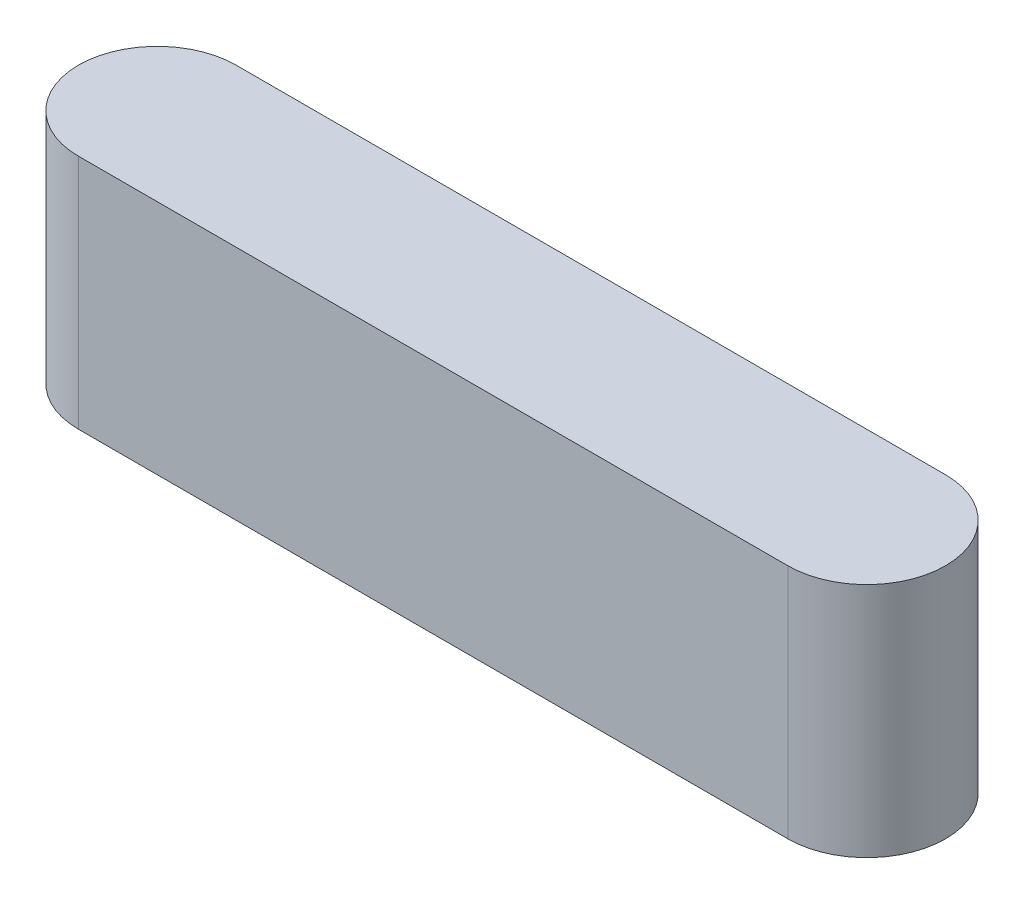
ISO-10303-21;
HEADER;
FILE_DESCRIPTION(('STEP AP214'),'2;1');
FILE_NAME('part.step','',(''),(''),'','','');
FILE_SCHEMA(('AUTOMOTIVE_DESIGN { 1 0 10303 214 1 1 1 1 }'));
ENDSEC;
DATA;
#1=APPLICATION_CONTEXT('core data for automotive mechanical design processes');
#2=APPLICATION_PROTOCOL_DEFINITION('international standard','automotive_design',2000,#1);
#3=PRODUCT_CONTEXT('',#1,'mechanical');
#4=PRODUCT('Part','Part','',(#3));
#5=PRODUCT_RELATED_PRODUCT_CATEGORY('part','',(#4));
#6=PRODUCT_DEFINITION_FORMATION('','',#4);
#7=PRODUCT_DEFINITION_CONTEXT('part definition',#1,'design');
#8=PRODUCT_DEFINITION('design','',#6,#7);
#9=PRODUCT_DEFINITION_SHAPE('','',#8);
#10=(LENGTH_UNIT() NAMED_UNIT(*) SI_UNIT(.MILLI.,.METRE.));
#11=(NAMED_UNIT(*) PLANE_ANGLE_UNIT() SI_UNIT($,.RADIAN.));
#12=(NAMED_UNIT(*) SI_UNIT($,.STERADIAN.) SOLID_ANGLE_UNIT());
#13=UNCERTAINTY_MEASURE_WITH_UNIT(LENGTH_MEASURE(1.E-05),#10,'distance_accuracy_value','');
#14=(GEOMETRIC_REPRESENTATION_CONTEXT(3) GLOBAL_UNCERTAINTY_ASSIGNED_CONTEXT((#13)) GLOBAL_UNIT_ASSIGNED_CONTEXT((#10,
#11,#12)) REPRESENTATION_CONTEXT('',''));
#15=CARTESIAN_POINT('',(0.,0.,0.));
#16=DIRECTION('',(0.,0.,1.));
#17=DIRECTION('',(1.,0.,0.));
#18=AXIS2_PLACEMENT_3D('',#15,#16,#17);
#19=CARTESIAN_POINT('',(22.5,7.5,0.));
#20=DIRECTION('',(0.,-1.,0.));
#21=DIRECTION('',(0.,0.,-1.));
#22=AXIS2_PLACEMENT_3D('',#19,#20,#21);
#23=CYLINDRICAL_SURFACE('',#22,5.);
#24=CARTESIAN_POINT('',(22.5,-7.5,0.));
#25=DIRECTION('',(0.,1.,0.));
#26=DIRECTION('',(0.,0.,1.));
#27=AXIS2_PLACEMENT_3D('',#24,#25,#26);
#28=CIRCLE('',#27,5.);
#29=CARTESIAN_POINT('',(22.5,-7.5,5.));
#30=VERTEX_POINT('',#29);
#31=CARTESIAN_POINT('',(22.5,-7.5,-5.));
#32=VERTEX_POINT('',#31);
#33=EDGE_CURVE('E107',#30,#32,#28,.T.);
#34=ORIENTED_EDGE('',*,*,#33,.T.);
#35=DIRECTION('',(0.,-1.,0.));
#36=VECTOR('',#35,1.);
#37=CARTESIAN_POINT('',(22.5,7.5,-5.));
#38=LINE('',#37,#36);
#39=CARTESIAN_POINT('',(22.5,7.5,-5.));
#40=VERTEX_POINT('',#39);
#41=EDGE_CURVE('E11',#40,#32,#38,.T.);
#42=ORIENTED_EDGE('',*,*,#41,.F.);
#43=CARTESIAN_POINT('',(22.5,7.5,0.));
#44=DIRECTION('',(0.,1.,0.));
#45=DIRECTION('',(0.,0.,1.));
#46=AXIS2_PLACEMENT_3D('',#43,#44,#45);
#47=CIRCLE('',#46,5.);
#48=CARTESIAN_POINT('',(22.5,7.5,5.));
#49=VERTEX_POINT('',#48);
#50=EDGE_CURVE('E91',#49,#40,#47,.T.);
#51=ORIENTED_EDGE('',*,*,#50,.F.);
#52=DIRECTION('',(0.,-1.,0.));
#53=VECTOR('',#52,1.);
#54=CARTESIAN_POINT('',(22.5,7.5,5.));
#55=LINE('',#54,#53);
#56=EDGE_CURVE('E103',#49,#30,#55,.T.);
#57=ORIENTED_EDGE('',*,*,#56,.T.);
#58=EDGE_LOOP('',(#34,#42,#51,#57));
#59=FACE_BOUND('',#58,.T.);
#60=ADVANCED_FACE('F39',(#59),#23,.T.);
#61=CARTESIAN_POINT('',(-22.5,7.5,-5.));
#62=DIRECTION('',(0.,0.,1.));
#63=DIRECTION('',(1.,0.,0.));
#64=AXIS2_PLACEMENT_3D('',#61,#62,#63);
#65=PLANE('',#64);
#66=DIRECTION('',(-1.,0.,0.));
#67=VECTOR('',#66,1.);
#68=CARTESIAN_POINT('',(-22.5,-7.5,-5.));
#69=LINE('',#68,#67);
#70=CARTESIAN_POINT('',(-22.5,-7.5,-5.));
#71=VERTEX_POINT('',#70);
#72=EDGE_CURVE('E96',#32,#71,#69,.T.);
#73=ORIENTED_EDGE('',*,*,#72,.T.);
#74=DIRECTION('',(0.,-1.,0.));
#75=VECTOR('',#74,1.);
#76=CARTESIAN_POINT('',(-22.5,7.5,-5.));
#77=LINE('',#76,#75);
#78=CARTESIAN_POINT('',(-22.5,7.5,-5.));
#79=VERTEX_POINT('',#78);
#80=EDGE_CURVE('E48',#79,#71,#77,.T.);
#81=ORIENTED_EDGE('',*,*,#80,.F.);
#82=DIRECTION('',(-1.,0.,0.));
#83=VECTOR('',#82,1.);
#84=CARTESIAN_POINT('',(-22.5,7.5,-5.));
#85=LINE('',#84,#83);
#86=EDGE_CURVE('E86',#40,#79,#85,.T.);
#87=ORIENTED_EDGE('',*,*,#86,.F.);
#88=ORIENTED_EDGE('',*,*,#41,.T.);
#89=EDGE_LOOP('',(#73,#81,#87,#88));
#90=FACE_BOUND('',#89,.T.);
#91=ADVANCED_FACE('F95',(#90),#65,.F.);
#92=CARTESIAN_POINT('',(-22.5,7.5,0.));
#93=DIRECTION('',(0.,-1.,0.));
#94=DIRECTION('',(0.,0.,-1.));
#95=AXIS2_PLACEMENT_3D('',#92,#93,#94);
#96=CYLINDRICAL_SURFACE('',#95,5.);
#97=CARTESIAN_POINT('',(-22.5,-7.5,0.));
#98=DIRECTION('',(0.,1.,0.));
#99=DIRECTION('',(0.,0.,1.));
#100=AXIS2_PLACEMENT_3D('',#97,#98,#99);
#101=CIRCLE('',#100,5.);
#102=CARTESIAN_POINT('',(-22.5,-7.5,5.));
#103=VERTEX_POINT('',#102);
#104=EDGE_CURVE('E73',#71,#103,#101,.T.);
#105=ORIENTED_EDGE('',*,*,#104,.T.);
#106=DIRECTION('',(0.,-1.,0.));
#107=VECTOR('',#106,1.);
#108=CARTESIAN_POINT('',(-22.5,7.5,5.));
#109=LINE('',#108,#107);
#110=CARTESIAN_POINT('',(-22.5,7.5,5.));
#111=VERTEX_POINT('',#110);
#112=EDGE_CURVE('E98',#111,#103,#109,.T.);
#113=ORIENTED_EDGE('',*,*,#112,.F.);
#114=CARTESIAN_POINT('',(-22.5,7.5,0.));
#115=DIRECTION('',(0.,1.,0.));
#116=DIRECTION('',(0.,0.,1.));
#117=AXIS2_PLACEMENT_3D('',#114,#115,#116);
#118=CIRCLE('',#117,5.);
#119=EDGE_CURVE('E89',#79,#111,#118,.T.);
#120=ORIENTED_EDGE('',*,*,#119,.F.);
#121=ORIENTED_EDGE('',*,*,#80,.T.);
#122=EDGE_LOOP('',(#105,#113,#120,#121));
#123=FACE_BOUND('',#122,.T.);
#124=ADVANCED_FACE('F99',(#123),#96,.T.);
#125=CARTESIAN_POINT('',(-22.5,7.5,5.));
#126=DIRECTION('',(0.,0.,-1.));
#127=DIRECTION('',(-1.,0.,0.));
#128=AXIS2_PLACEMENT_3D('',#125,#126,#127);
#129=PLANE('',#128);
#130=DIRECTION('',(1.,0.,0.));
#131=VECTOR('',#130,1.);
#132=CARTESIAN_POINT('',(-22.5,-7.5,5.));
#133=LINE('',#132,#131);
#134=EDGE_CURVE('E79',#103,#30,#133,.T.);
#135=ORIENTED_EDGE('',*,*,#134,.T.);
#136=ORIENTED_EDGE('',*,*,#56,.F.);
#137=DIRECTION('',(1.,0.,0.));
#138=VECTOR('',#137,1.);
#139=CARTESIAN_POINT('',(-22.5,7.5,5.));
#140=LINE('',#139,#138);
#141=EDGE_CURVE('E56',#111,#49,#140,.T.);
#142=ORIENTED_EDGE('',*,*,#141,.F.);
#143=ORIENTED_EDGE('',*,*,#112,.T.);
#144=EDGE_LOOP('',(#135,#136,#142,#143));
#145=FACE_BOUND('',#144,.T.);
#146=ADVANCED_FACE('F120',(#145),#129,.F.);
#147=CARTESIAN_POINT('',(22.5,7.5,0.));
#148=DIRECTION('',(0.,1.,0.));
#149=DIRECTION('',(0.,0.,1.));
#150=AXIS2_PLACEMENT_3D('',#147,#148,#149);
#151=PLANE('',#150);
#152=ORIENTED_EDGE('',*,*,#50,.T.);
#153=ORIENTED_EDGE('',*,*,#86,.T.);
#154=ORIENTED_EDGE('',*,*,#119,.T.);
#155=ORIENTED_EDGE('',*,*,#141,.T.);
#156=EDGE_LOOP('',(#152,#153,#154,#155));
#157=FACE_BOUND('',#156,.T.);
#158=ADVANCED_FACE('F87',(#157),#151,.T.);
#159=CARTESIAN_POINT('',(22.5,-7.5,0.));
#160=DIRECTION('',(0.,1.,0.));
#161=DIRECTION('',(0.,0.,1.));
#162=AXIS2_PLACEMENT_3D('',#159,#160,#161);
#163=PLANE('',#162);
#164=ORIENTED_EDGE('',*,*,#33,.F.);
#165=ORIENTED_EDGE('',*,*,#134,.F.);
#166=ORIENTED_EDGE('',*,*,#104,.F.);
#167=ORIENTED_EDGE('',*,*,#72,.F.);
#168=EDGE_LOOP('',(#164,#165,#166,#167));
#169=FACE_BOUND('',#168,.T.);
#170=ADVANCED_FACE('F123',(#169),#163,.F.);
#171=CLOSED_SHELL('',(#60,#91,#124,#146,#158,#170));
#172=MANIFOLD_SOLID_BREP('B2',#171);
#173=ADVANCED_BREP_SHAPE_REPRESENTATION('',(#18,#172),#14);
#174=SHAPE_DEFINITION_REPRESENTATION(#9,#173);
ENDSEC;
END-ISO-10303-21;
